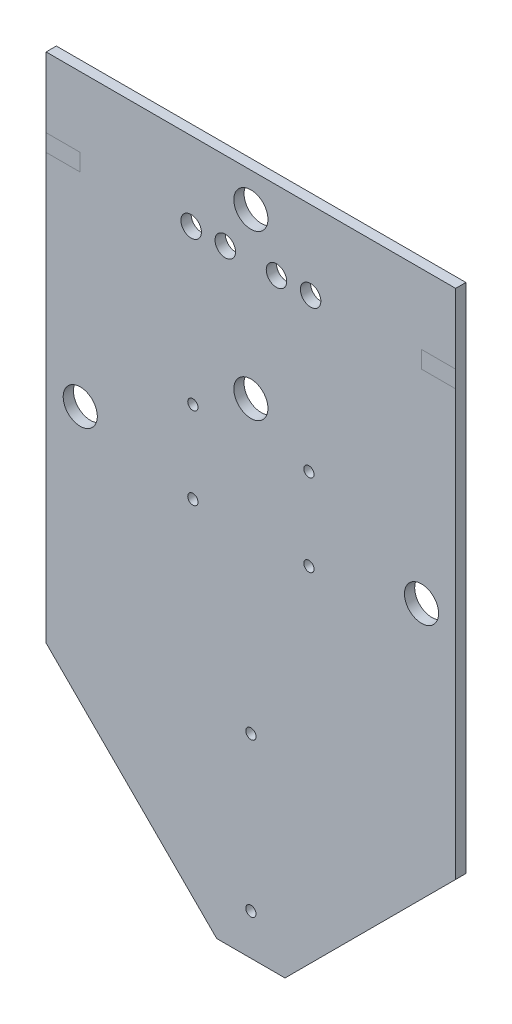
ISO-10303-21;
HEADER;
FILE_DESCRIPTION(('STEP AP214'),'2;1');
FILE_NAME('part.step','',(''),(''),'','','');
FILE_SCHEMA(('AUTOMOTIVE_DESIGN { 1 0 10303 214 1 1 1 1 }'));
ENDSEC;
DATA;
#1=APPLICATION_CONTEXT('core data for automotive mechanical design processes');
#2=APPLICATION_PROTOCOL_DEFINITION('international standard','automotive_design',2000,#1);
#3=PRODUCT_CONTEXT('',#1,'mechanical');
#4=PRODUCT('Part','Part','',(#3));
#5=PRODUCT_RELATED_PRODUCT_CATEGORY('part','',(#4));
#6=PRODUCT_DEFINITION_FORMATION('','',#4);
#7=PRODUCT_DEFINITION_CONTEXT('part definition',#1,'design');
#8=PRODUCT_DEFINITION('design','',#6,#7);
#9=PRODUCT_DEFINITION_SHAPE('','',#8);
#10=(LENGTH_UNIT() NAMED_UNIT(*) SI_UNIT(.MILLI.,.METRE.));
#11=(NAMED_UNIT(*) PLANE_ANGLE_UNIT() SI_UNIT($,.RADIAN.));
#12=(NAMED_UNIT(*) SI_UNIT($,.STERADIAN.) SOLID_ANGLE_UNIT());
#13=UNCERTAINTY_MEASURE_WITH_UNIT(LENGTH_MEASURE(1.E-05),#10,'distance_accuracy_value','');
#14=(GEOMETRIC_REPRESENTATION_CONTEXT(3) GLOBAL_UNCERTAINTY_ASSIGNED_CONTEXT((#13)) GLOBAL_UNIT_ASSIGNED_CONTEXT((#10,
#11,#12)) REPRESENTATION_CONTEXT('',''));
#15=CARTESIAN_POINT('',(0.,0.,0.));
#16=DIRECTION('',(0.,0.,1.));
#17=DIRECTION('',(1.,0.,0.));
#18=AXIS2_PLACEMENT_3D('',#15,#16,#17);
#19=CARTESIAN_POINT('',(0.,-200.,0.));
#20=DIRECTION('',(0.,0.,-1.));
#21=DIRECTION('',(-1.,0.,0.));
#22=AXIS2_PLACEMENT_3D('',#19,#20,#21);
#23=PLANE('',#22);
#24=CARTESIAN_POINT('',(-60.,-58.,0.));
#25=DIRECTION('',(0.,0.,-1.));
#26=DIRECTION('',(-1.,0.,0.));
#27=AXIS2_PLACEMENT_3D('',#24,#25,#26);
#28=CIRCLE('',#27,4.99999999999999);
#29=CARTESIAN_POINT('',(-65.,-58.,0.));
#30=VERTEX_POINT('',#29);
#31=EDGE_CURVE('E376',#30,#30,#28,.T.);
#32=ORIENTED_EDGE('',*,*,#31,.F.);
#33=EDGE_LOOP('',(#32));
#34=FACE_BOUND('',#33,.T.);
#35=CARTESIAN_POINT('',(-43.,-92.,0.));
#36=DIRECTION('',(0.,0.,1.));
#37=DIRECTION('',(1.,0.,0.));
#38=AXIS2_PLACEMENT_3D('',#35,#36,#37);
#39=CIRCLE('',#38,1.5);
#40=CARTESIAN_POINT('',(-41.5,-92.,0.));
#41=VERTEX_POINT('',#40);
#42=EDGE_CURVE('E363',#41,#41,#39,.T.);
#43=ORIENTED_EDGE('',*,*,#42,.T.);
#44=EDGE_LOOP('',(#43));
#45=FACE_BOUND('',#44,.T.);
#46=CARTESIAN_POINT('',(-77.,-68.,0.));
#47=DIRECTION('',(0.,0.,1.));
#48=DIRECTION('',(1.,0.,0.));
#49=AXIS2_PLACEMENT_3D('',#46,#47,#48);
#50=CIRCLE('',#49,1.5);
#51=CARTESIAN_POINT('',(-75.5,-68.,0.));
#52=VERTEX_POINT('',#51);
#53=EDGE_CURVE('E356',#52,#52,#50,.T.);
#54=ORIENTED_EDGE('',*,*,#53,.T.);
#55=EDGE_LOOP('',(#54));
#56=FACE_BOUND('',#55,.T.);
#57=DIRECTION('',(0.,1.,0.));
#58=VECTOR('',#57,1.);
#59=CARTESIAN_POINT('',(0.,-150.,0.));
#60=LINE('',#59,#58);
#61=CARTESIAN_POINT('',(0.,-150.,0.));
#62=VERTEX_POINT('',#61);
#63=CARTESIAN_POINT('',(0.,0.,0.));
#64=VERTEX_POINT('',#63);
#65=EDGE_CURVE('E310',#62,#64,#60,.T.);
#66=ORIENTED_EDGE('',*,*,#65,.F.);
#67=DIRECTION('',(0.707106781186548,0.707106781186547,0.));
#68=VECTOR('',#67,1.);
#69=CARTESIAN_POINT('',(-50.0000000000002,-200.,0.));
#70=LINE('',#69,#68);
#71=CARTESIAN_POINT('',(-50.0000000000002,-200.,0.));
#72=VERTEX_POINT('',#71);
#73=EDGE_CURVE('E338',#72,#62,#70,.T.);
#74=ORIENTED_EDGE('',*,*,#73,.F.);
#75=DIRECTION('',(1.,0.,0.));
#76=VECTOR('',#75,1.);
#77=CARTESIAN_POINT('',(-70.0000000000002,-200.,0.));
#78=LINE('',#77,#76);
#79=CARTESIAN_POINT('',(-70.0000000000002,-200.,0.));
#80=VERTEX_POINT('',#79);
#81=EDGE_CURVE('E336',#80,#72,#78,.T.);
#82=ORIENTED_EDGE('',*,*,#81,.F.);
#83=DIRECTION('',(0.707106781186546,-0.707106781186549,0.));
#84=VECTOR('',#83,1.);
#85=CARTESIAN_POINT('',(-120.,-150.,0.));
#86=LINE('',#85,#84);
#87=CARTESIAN_POINT('',(-120.,-150.,0.));
#88=VERTEX_POINT('',#87);
#89=EDGE_CURVE('E334',#88,#80,#86,.T.);
#90=ORIENTED_EDGE('',*,*,#89,.F.);
#91=DIRECTION('',(0.,-1.,0.));
#92=VECTOR('',#91,1.);
#93=CARTESIAN_POINT('',(-120.,0.,0.));
#94=LINE('',#93,#92);
#95=CARTESIAN_POINT('',(-120.,0.,0.));
#96=VERTEX_POINT('',#95);
#97=EDGE_CURVE('E332',#96,#88,#94,.T.);
#98=ORIENTED_EDGE('',*,*,#97,.F.);
#99=DIRECTION('',(-1.,0.,0.));
#100=VECTOR('',#99,1.);
#101=CARTESIAN_POINT('',(0.,0.,0.));
#102=LINE('',#101,#100);
#103=EDGE_CURVE('E330',#64,#96,#102,.T.);
#104=ORIENTED_EDGE('',*,*,#103,.F.);
#105=EDGE_LOOP('',(#66,#74,#82,#90,#98,#104));
#106=FACE_BOUND('',#105,.T.);
#107=CARTESIAN_POINT('',(-60.,-10.,0.));
#108=DIRECTION('',(0.,0.,-1.));
#109=DIRECTION('',(-1.,0.,0.));
#110=AXIS2_PLACEMENT_3D('',#107,#108,#109);
#111=CIRCLE('',#110,5.);
#112=CARTESIAN_POINT('',(-65.,-10.,0.));
#113=VERTEX_POINT('',#112);
#114=EDGE_CURVE('E304',#113,#113,#111,.T.);
#115=ORIENTED_EDGE('',*,*,#114,.F.);
#116=EDGE_LOOP('',(#115));
#117=FACE_BOUND('',#116,.T.);
#118=CARTESIAN_POINT('',(-9.99999999999992,-85.,0.));
#119=DIRECTION('',(0.,0.,-1.));
#120=DIRECTION('',(-1.,0.,0.));
#121=AXIS2_PLACEMENT_3D('',#118,#119,#120);
#122=CIRCLE('',#121,5.);
#123=CARTESIAN_POINT('',(-14.9999999999999,-85.,0.));
#124=VERTEX_POINT('',#123);
#125=EDGE_CURVE('E298',#124,#124,#122,.T.);
#126=ORIENTED_EDGE('',*,*,#125,.F.);
#127=EDGE_LOOP('',(#126));
#128=FACE_BOUND('',#127,.T.);
#129=CARTESIAN_POINT('',(-110.,-84.9999999999999,0.));
#130=DIRECTION('',(0.,0.,-1.));
#131=DIRECTION('',(-1.,0.,0.));
#132=AXIS2_PLACEMENT_3D('',#129,#130,#131);
#133=CIRCLE('',#132,5.00000000000002);
#134=CARTESIAN_POINT('',(-115.,-84.9999999999999,0.));
#135=VERTEX_POINT('',#134);
#136=EDGE_CURVE('E292',#135,#135,#133,.T.);
#137=ORIENTED_EDGE('',*,*,#136,.F.);
#138=EDGE_LOOP('',(#137));
#139=FACE_BOUND('',#138,.T.);
#140=CARTESIAN_POINT('',(-52.5,-23.,0.));
#141=DIRECTION('',(0.,0.,-1.));
#142=DIRECTION('',(-1.,0.,0.));
#143=AXIS2_PLACEMENT_3D('',#140,#141,#142);
#144=CIRCLE('',#143,3.);
#145=CARTESIAN_POINT('',(-55.5,-23.,0.));
#146=VERTEX_POINT('',#145);
#147=EDGE_CURVE('E286',#146,#146,#144,.T.);
#148=ORIENTED_EDGE('',*,*,#147,.F.);
#149=EDGE_LOOP('',(#148));
#150=FACE_BOUND('',#149,.T.);
#151=CARTESIAN_POINT('',(-42.5,-23.,0.));
#152=DIRECTION('',(0.,0.,-1.));
#153=DIRECTION('',(-1.,0.,0.));
#154=AXIS2_PLACEMENT_3D('',#151,#152,#153);
#155=CIRCLE('',#154,3.);
#156=CARTESIAN_POINT('',(-45.5,-23.,0.));
#157=VERTEX_POINT('',#156);
#158=EDGE_CURVE('E280',#157,#157,#155,.T.);
#159=ORIENTED_EDGE('',*,*,#158,.F.);
#160=EDGE_LOOP('',(#159));
#161=FACE_BOUND('',#160,.T.);
#162=CARTESIAN_POINT('',(-67.5,-23.,0.));
#163=DIRECTION('',(0.,0.,-1.));
#164=DIRECTION('',(1.,0.,0.));
#165=AXIS2_PLACEMENT_3D('',#162,#163,#164);
#166=CIRCLE('',#165,3.00000000000001);
#167=CARTESIAN_POINT('',(-64.5,-23.,0.));
#168=VERTEX_POINT('',#167);
#169=EDGE_CURVE('E274',#168,#168,#166,.T.);
#170=ORIENTED_EDGE('',*,*,#169,.F.);
#171=EDGE_LOOP('',(#170));
#172=FACE_BOUND('',#171,.T.);
#173=CARTESIAN_POINT('',(-77.5,-23.,0.));
#174=DIRECTION('',(0.,0.,-1.));
#175=DIRECTION('',(1.,0.,0.));
#176=AXIS2_PLACEMENT_3D('',#173,#174,#175);
#177=CIRCLE('',#176,3.00000000000001);
#178=CARTESIAN_POINT('',(-74.5,-23.,0.));
#179=VERTEX_POINT('',#178);
#180=EDGE_CURVE('E268',#179,#179,#177,.T.);
#181=ORIENTED_EDGE('',*,*,#180,.F.);
#182=EDGE_LOOP('',(#181));
#183=FACE_BOUND('',#182,.T.);
#184=CARTESIAN_POINT('',(-60.0000000000002,-143.,0.));
#185=DIRECTION('',(0.,0.,-1.));
#186=DIRECTION('',(-1.,0.,0.));
#187=AXIS2_PLACEMENT_3D('',#184,#185,#186);
#188=CIRCLE('',#187,1.5);
#189=CARTESIAN_POINT('',(-61.5000000000002,-143.,0.));
#190=VERTEX_POINT('',#189);
#191=EDGE_CURVE('E262',#190,#190,#188,.T.);
#192=ORIENTED_EDGE('',*,*,#191,.F.);
#193=EDGE_LOOP('',(#192));
#194=FACE_BOUND('',#193,.T.);
#195=CARTESIAN_POINT('',(-60.0000000000002,-188.,0.));
#196=DIRECTION('',(0.,0.,-1.));
#197=DIRECTION('',(-1.,0.,0.));
#198=AXIS2_PLACEMENT_3D('',#195,#196,#197);
#199=CIRCLE('',#198,1.5);
#200=CARTESIAN_POINT('',(-61.5000000000002,-188.,0.));
#201=VERTEX_POINT('',#200);
#202=EDGE_CURVE('E251',#201,#201,#199,.T.);
#203=ORIENTED_EDGE('',*,*,#202,.F.);
#204=EDGE_LOOP('',(#203));
#205=FACE_BOUND('',#204,.T.);
#206=DIRECTION('',(0.,-1.,0.));
#207=VECTOR('',#206,1.);
#208=CARTESIAN_POINT('',(-28.,-139.,0.));
#209=LINE('',#208,#207);
#210=CARTESIAN_POINT('',(-28.,-133.994670830339,0.));
#211=VERTEX_POINT('',#210);
#212=CARTESIAN_POINT('',(-28.,-139.,0.));
#213=VERTEX_POINT('',#212);
#214=EDGE_CURVE('E391',#211,#213,#209,.T.);
#215=ORIENTED_EDGE('',*,*,#214,.F.);
#216=DIRECTION('',(1.,0.,0.));
#217=VECTOR('',#216,1.);
#218=CARTESIAN_POINT('',(-28.,-133.994670830339,0.));
#219=LINE('',#218,#217);
#220=CARTESIAN_POINT('',(-30.,-133.994670830339,0.));
#221=VERTEX_POINT('',#220);
#222=EDGE_CURVE('E193',#221,#211,#219,.T.);
#223=ORIENTED_EDGE('',*,*,#222,.F.);
#224=DIRECTION('',(0.,1.,0.));
#225=VECTOR('',#224,1.);
#226=CARTESIAN_POINT('',(-30.,-133.994670830339,0.));
#227=LINE('',#226,#225);
#228=CARTESIAN_POINT('',(-30.,-137.,0.));
#229=VERTEX_POINT('',#228);
#230=EDGE_CURVE('E189',#229,#221,#227,.T.);
#231=ORIENTED_EDGE('',*,*,#230,.F.);
#232=DIRECTION('',(1.,0.,0.));
#233=VECTOR('',#232,1.);
#234=CARTESIAN_POINT('',(-30.,-137.,0.));
#235=LINE('',#234,#233);
#236=CARTESIAN_POINT('',(-31.859648796441,-137.,0.));
#237=VERTEX_POINT('',#236);
#238=EDGE_CURVE('E397',#237,#229,#235,.T.);
#239=ORIENTED_EDGE('',*,*,#238,.F.);
#240=DIRECTION('',(0.,1.,0.));
#241=VECTOR('',#240,1.);
#242=CARTESIAN_POINT('',(-31.859648796441,-137.,0.));
#243=LINE('',#242,#241);
#244=CARTESIAN_POINT('',(-31.859648796441,-139.,0.));
#245=VERTEX_POINT('',#244);
#246=EDGE_CURVE('E395',#245,#237,#243,.T.);
#247=ORIENTED_EDGE('',*,*,#246,.F.);
#248=DIRECTION('',(-1.,0.,0.));
#249=VECTOR('',#248,1.);
#250=CARTESIAN_POINT('',(-31.859648796441,-139.,0.));
#251=LINE('',#250,#249);
#252=EDGE_CURVE('E393',#213,#245,#251,.T.);
#253=ORIENTED_EDGE('',*,*,#252,.F.);
#254=EDGE_LOOP('',(#215,#223,#231,#239,#247,#253));
#255=FACE_BOUND('',#254,.T.);
#256=CARTESIAN_POINT('',(-43.,-68.,0.));
#257=DIRECTION('',(0.,0.,1.));
#258=DIRECTION('',(1.,0.,0.));
#259=AXIS2_PLACEMENT_3D('',#256,#257,#258);
#260=CIRCLE('',#259,1.5);
#261=CARTESIAN_POINT('',(-41.5,-68.,0.));
#262=VERTEX_POINT('',#261);
#263=EDGE_CURVE('E360',#262,#262,#260,.T.);
#264=ORIENTED_EDGE('',*,*,#263,.T.);
#265=EDGE_LOOP('',(#264));
#266=FACE_BOUND('',#265,.T.);
#267=CARTESIAN_POINT('',(-77.,-92.,0.));
#268=DIRECTION('',(0.,0.,1.));
#269=DIRECTION('',(1.,0.,0.));
#270=AXIS2_PLACEMENT_3D('',#267,#268,#269);
#271=CIRCLE('',#270,1.5);
#272=CARTESIAN_POINT('',(-75.5,-92.,0.));
#273=VERTEX_POINT('',#272);
#274=EDGE_CURVE('E366',#273,#273,#271,.T.);
#275=ORIENTED_EDGE('',*,*,#274,.T.);
#276=EDGE_LOOP('',(#275));
#277=FACE_BOUND('',#276,.T.);
#278=ADVANCED_FACE('F31',(#34,#45,#56,#106,#117,#128,#139,#150,#161,#172,#183,#194,#205,#255,
#266,#277),#23,.T.);
#279=CARTESIAN_POINT('',(0.,-200.,3.));
#280=DIRECTION('',(0.,0.,-1.));
#281=DIRECTION('',(-1.,0.,0.));
#282=AXIS2_PLACEMENT_3D('',#279,#280,#281);
#283=PLANE('',#282);
#284=CARTESIAN_POINT('',(-60.,-58.,3.));
#285=DIRECTION('',(0.,0.,-1.));
#286=DIRECTION('',(-1.,0.,0.));
#287=AXIS2_PLACEMENT_3D('',#284,#285,#286);
#288=CIRCLE('',#287,4.99999999999999);
#289=CARTESIAN_POINT('',(-65.,-58.,3.));
#290=VERTEX_POINT('',#289);
#291=EDGE_CURVE('E35',#290,#290,#288,.T.);
#292=ORIENTED_EDGE('',*,*,#291,.T.);
#293=EDGE_LOOP('',(#292));
#294=FACE_BOUND('',#293,.T.);
#295=CARTESIAN_POINT('',(-43.,-92.,3.));
#296=DIRECTION('',(0.,0.,-1.));
#297=DIRECTION('',(-1.,0.,0.));
#298=AXIS2_PLACEMENT_3D('',#295,#296,#297);
#299=CIRCLE('',#298,1.5);
#300=CARTESIAN_POINT('',(-44.5,-92.,3.));
#301=VERTEX_POINT('',#300);
#302=EDGE_CURVE('E361',#301,#301,#299,.F.);
#303=ORIENTED_EDGE('',*,*,#302,.F.);
#304=EDGE_LOOP('',(#303));
#305=FACE_BOUND('',#304,.T.);
#306=CARTESIAN_POINT('',(-77.,-68.,3.));
#307=DIRECTION('',(0.,0.,-1.));
#308=DIRECTION('',(-1.,0.,0.));
#309=AXIS2_PLACEMENT_3D('',#306,#307,#308);
#310=CIRCLE('',#309,1.5);
#311=CARTESIAN_POINT('',(-78.5,-68.,3.));
#312=VERTEX_POINT('',#311);
#313=EDGE_CURVE('E353',#312,#312,#310,.F.);
#314=ORIENTED_EDGE('',*,*,#313,.F.);
#315=EDGE_LOOP('',(#314));
#316=FACE_BOUND('',#315,.T.);
#317=CARTESIAN_POINT('',(-60.0000000000002,-188.,3.));
#318=DIRECTION('',(0.,0.,-1.));
#319=DIRECTION('',(-1.,0.,0.));
#320=AXIS2_PLACEMENT_3D('',#317,#318,#319);
#321=CIRCLE('',#320,1.5);
#322=CARTESIAN_POINT('',(-61.5000000000002,-188.,3.));
#323=VERTEX_POINT('',#322);
#324=EDGE_CURVE('E259',#323,#323,#321,.T.);
#325=ORIENTED_EDGE('',*,*,#324,.T.);
#326=EDGE_LOOP('',(#325));
#327=FACE_BOUND('',#326,.T.);
#328=CARTESIAN_POINT('',(-60.0000000000002,-143.,3.));
#329=DIRECTION('',(0.,0.,-1.));
#330=DIRECTION('',(-1.,0.,0.));
#331=AXIS2_PLACEMENT_3D('',#328,#329,#330);
#332=CIRCLE('',#331,1.5);
#333=CARTESIAN_POINT('',(-61.5000000000002,-143.,3.));
#334=VERTEX_POINT('',#333);
#335=EDGE_CURVE('E265',#334,#334,#332,.T.);
#336=ORIENTED_EDGE('',*,*,#335,.T.);
#337=EDGE_LOOP('',(#336));
#338=FACE_BOUND('',#337,.T.);
#339=CARTESIAN_POINT('',(-77.5,-23.,3.));
#340=DIRECTION('',(0.,0.,-1.));
#341=DIRECTION('',(-1.,0.,0.));
#342=AXIS2_PLACEMENT_3D('',#339,#340,#341);
#343=CIRCLE('',#342,3.00000000000001);
#344=CARTESIAN_POINT('',(-80.5,-23.,3.));
#345=VERTEX_POINT('',#344);
#346=EDGE_CURVE('E271',#345,#345,#343,.T.);
#347=ORIENTED_EDGE('',*,*,#346,.T.);
#348=EDGE_LOOP('',(#347));
#349=FACE_BOUND('',#348,.T.);
#350=CARTESIAN_POINT('',(-67.5,-23.,3.));
#351=DIRECTION('',(0.,0.,-1.));
#352=DIRECTION('',(-1.,0.,0.));
#353=AXIS2_PLACEMENT_3D('',#350,#351,#352);
#354=CIRCLE('',#353,3.00000000000001);
#355=CARTESIAN_POINT('',(-70.5,-23.,3.));
#356=VERTEX_POINT('',#355);
#357=EDGE_CURVE('E277',#356,#356,#354,.T.);
#358=ORIENTED_EDGE('',*,*,#357,.T.);
#359=EDGE_LOOP('',(#358));
#360=FACE_BOUND('',#359,.T.);
#361=CARTESIAN_POINT('',(-42.5,-23.,3.));
#362=DIRECTION('',(0.,0.,-1.));
#363=DIRECTION('',(-1.,0.,0.));
#364=AXIS2_PLACEMENT_3D('',#361,#362,#363);
#365=CIRCLE('',#364,3.);
#366=CARTESIAN_POINT('',(-45.5,-23.,3.));
#367=VERTEX_POINT('',#366);
#368=EDGE_CURVE('E283',#367,#367,#365,.T.);
#369=ORIENTED_EDGE('',*,*,#368,.T.);
#370=EDGE_LOOP('',(#369));
#371=FACE_BOUND('',#370,.T.);
#372=CARTESIAN_POINT('',(-52.5,-23.,3.));
#373=DIRECTION('',(0.,0.,-1.));
#374=DIRECTION('',(-1.,0.,0.));
#375=AXIS2_PLACEMENT_3D('',#372,#373,#374);
#376=CIRCLE('',#375,3.);
#377=CARTESIAN_POINT('',(-55.5,-23.,3.));
#378=VERTEX_POINT('',#377);
#379=EDGE_CURVE('E289',#378,#378,#376,.T.);
#380=ORIENTED_EDGE('',*,*,#379,.T.);
#381=EDGE_LOOP('',(#380));
#382=FACE_BOUND('',#381,.T.);
#383=CARTESIAN_POINT('',(-110.,-84.9999999999999,3.));
#384=DIRECTION('',(0.,0.,-1.));
#385=DIRECTION('',(-1.,0.,0.));
#386=AXIS2_PLACEMENT_3D('',#383,#384,#385);
#387=CIRCLE('',#386,5.00000000000002);
#388=CARTESIAN_POINT('',(-115.,-84.9999999999999,3.));
#389=VERTEX_POINT('',#388);
#390=EDGE_CURVE('E295',#389,#389,#387,.T.);
#391=ORIENTED_EDGE('',*,*,#390,.T.);
#392=EDGE_LOOP('',(#391));
#393=FACE_BOUND('',#392,.T.);
#394=CARTESIAN_POINT('',(-9.99999999999992,-85.,3.));
#395=DIRECTION('',(0.,0.,-1.));
#396=DIRECTION('',(-1.,0.,0.));
#397=AXIS2_PLACEMENT_3D('',#394,#395,#396);
#398=CIRCLE('',#397,5.);
#399=CARTESIAN_POINT('',(-14.9999999999999,-85.,3.));
#400=VERTEX_POINT('',#399);
#401=EDGE_CURVE('E301',#400,#400,#398,.T.);
#402=ORIENTED_EDGE('',*,*,#401,.T.);
#403=EDGE_LOOP('',(#402));
#404=FACE_BOUND('',#403,.T.);
#405=CARTESIAN_POINT('',(-60.,-10.,3.));
#406=DIRECTION('',(0.,0.,-1.));
#407=DIRECTION('',(-1.,0.,0.));
#408=AXIS2_PLACEMENT_3D('',#405,#406,#407);
#409=CIRCLE('',#408,5.);
#410=CARTESIAN_POINT('',(-65.,-10.,3.));
#411=VERTEX_POINT('',#410);
#412=EDGE_CURVE('E307',#411,#411,#409,.T.);
#413=ORIENTED_EDGE('',*,*,#412,.T.);
#414=EDGE_LOOP('',(#413));
#415=FACE_BOUND('',#414,.T.);
#416=DIRECTION('',(0.,-1.,0.));
#417=VECTOR('',#416,1.);
#418=CARTESIAN_POINT('',(-9.99999999999999,-20.5,3.));
#419=LINE('',#418,#417);
#420=CARTESIAN_POINT('',(-9.99999999999999,-20.5,3.));
#421=VERTEX_POINT('',#420);
#422=CARTESIAN_POINT('',(-9.99999999999999,-25.5,3.));
#423=VERTEX_POINT('',#422);
#424=EDGE_CURVE('E196',#421,#423,#419,.T.);
#425=ORIENTED_EDGE('',*,*,#424,.F.);
#426=DIRECTION('',(-1.,0.,0.));
#427=VECTOR('',#426,1.);
#428=CARTESIAN_POINT('',(0.,-20.5,3.));
#429=LINE('',#428,#427);
#430=CARTESIAN_POINT('',(0.,-20.5,3.));
#431=VERTEX_POINT('',#430);
#432=EDGE_CURVE('E56',#431,#421,#429,.T.);
#433=ORIENTED_EDGE('',*,*,#432,.F.);
#434=DIRECTION('',(0.,1.,0.));
#435=VECTOR('',#434,1.);
#436=CARTESIAN_POINT('',(0.,-150.,3.));
#437=LINE('',#436,#435);
#438=CARTESIAN_POINT('',(0.,0.,3.));
#439=VERTEX_POINT('',#438);
#440=EDGE_CURVE('E315',#431,#439,#437,.T.);
#441=ORIENTED_EDGE('',*,*,#440,.T.);
#442=DIRECTION('',(-1.,0.,0.));
#443=VECTOR('',#442,1.);
#444=CARTESIAN_POINT('',(0.,0.,3.));
#445=LINE('',#444,#443);
#446=CARTESIAN_POINT('',(-120.,0.,3.));
#447=VERTEX_POINT('',#446);
#448=EDGE_CURVE('E314',#439,#447,#445,.T.);
#449=ORIENTED_EDGE('',*,*,#448,.T.);
#450=DIRECTION('',(0.,-1.,0.));
#451=VECTOR('',#450,1.);
#452=CARTESIAN_POINT('',(-120.,0.,3.));
#453=LINE('',#452,#451);
#454=CARTESIAN_POINT('',(-120.,-20.5,3.));
#455=VERTEX_POINT('',#454);
#456=EDGE_CURVE('E318',#447,#455,#453,.T.);
#457=ORIENTED_EDGE('',*,*,#456,.T.);
#458=DIRECTION('',(-1.,0.,0.));
#459=VECTOR('',#458,1.);
#460=CARTESIAN_POINT('',(-120.,-20.5,3.));
#461=LINE('',#460,#459);
#462=CARTESIAN_POINT('',(-110.,-20.5,3.));
#463=VERTEX_POINT('',#462);
#464=EDGE_CURVE('E232',#463,#455,#461,.T.);
#465=ORIENTED_EDGE('',*,*,#464,.F.);
#466=DIRECTION('',(0.,1.,0.));
#467=VECTOR('',#466,1.);
#468=CARTESIAN_POINT('',(-110.,-20.5,3.));
#469=LINE('',#468,#467);
#470=CARTESIAN_POINT('',(-110.,-25.5,3.));
#471=VERTEX_POINT('',#470);
#472=EDGE_CURVE('E244',#471,#463,#469,.T.);
#473=ORIENTED_EDGE('',*,*,#472,.F.);
#474=DIRECTION('',(1.,0.,0.));
#475=VECTOR('',#474,1.);
#476=CARTESIAN_POINT('',(-120.,-25.5,3.));
#477=LINE('',#476,#475);
#478=CARTESIAN_POINT('',(-120.,-25.5,3.));
#479=VERTEX_POINT('',#478);
#480=EDGE_CURVE('E221',#479,#471,#477,.T.);
#481=ORIENTED_EDGE('',*,*,#480,.F.);
#482=CARTESIAN_POINT('',(-120.,-150.,3.));
#483=VERTEX_POINT('',#482);
#484=EDGE_CURVE('E317',#479,#483,#453,.T.);
#485=ORIENTED_EDGE('',*,*,#484,.T.);
#486=DIRECTION('',(0.707106781186546,-0.707106781186549,0.));
#487=VECTOR('',#486,1.);
#488=CARTESIAN_POINT('',(-120.,-150.,3.));
#489=LINE('',#488,#487);
#490=CARTESIAN_POINT('',(-70.0000000000002,-200.,3.));
#491=VERTEX_POINT('',#490);
#492=EDGE_CURVE('E321',#483,#491,#489,.T.);
#493=ORIENTED_EDGE('',*,*,#492,.T.);
#494=DIRECTION('',(1.,0.,0.));
#495=VECTOR('',#494,1.);
#496=CARTESIAN_POINT('',(-70.0000000000002,-200.,3.));
#497=LINE('',#496,#495);
#498=CARTESIAN_POINT('',(-50.0000000000002,-200.,3.));
#499=VERTEX_POINT('',#498);
#500=EDGE_CURVE('E323',#491,#499,#497,.T.);
#501=ORIENTED_EDGE('',*,*,#500,.T.);
#502=DIRECTION('',(0.707106781186548,0.707106781186547,0.));
#503=VECTOR('',#502,1.);
#504=CARTESIAN_POINT('',(-50.0000000000002,-200.,3.));
#505=LINE('',#504,#503);
#506=CARTESIAN_POINT('',(0.,-150.,3.));
#507=VERTEX_POINT('',#506);
#508=EDGE_CURVE('E325',#499,#507,#505,.T.);
#509=ORIENTED_EDGE('',*,*,#508,.T.);
#510=CARTESIAN_POINT('',(0.,-25.5,3.));
#511=VERTEX_POINT('',#510);
#512=EDGE_CURVE('E311',#507,#511,#437,.T.);
#513=ORIENTED_EDGE('',*,*,#512,.T.);
#514=DIRECTION('',(1.,0.,0.));
#515=VECTOR('',#514,1.);
#516=CARTESIAN_POINT('',(0.,-25.5,3.));
#517=LINE('',#516,#515);
#518=EDGE_CURVE('E206',#423,#511,#517,.T.);
#519=ORIENTED_EDGE('',*,*,#518,.F.);
#520=EDGE_LOOP('',(#425,#433,#441,#449,#457,#465,#473,#481,#485,#493,#501,#509,#513,#519));
#521=FACE_BOUND('',#520,.T.);
#522=CARTESIAN_POINT('',(-43.,-68.,3.));
#523=DIRECTION('',(0.,0.,-1.));
#524=DIRECTION('',(-1.,0.,0.));
#525=AXIS2_PLACEMENT_3D('',#522,#523,#524);
#526=CIRCLE('',#525,1.5);
#527=CARTESIAN_POINT('',(-44.5,-68.,3.));
#528=VERTEX_POINT('',#527);
#529=EDGE_CURVE('E357',#528,#528,#526,.F.);
#530=ORIENTED_EDGE('',*,*,#529,.F.);
#531=EDGE_LOOP('',(#530));
#532=FACE_BOUND('',#531,.T.);
#533=CARTESIAN_POINT('',(-77.,-92.,3.));
#534=DIRECTION('',(0.,0.,-1.));
#535=DIRECTION('',(-1.,0.,0.));
#536=AXIS2_PLACEMENT_3D('',#533,#534,#535);
#537=CIRCLE('',#536,1.5);
#538=CARTESIAN_POINT('',(-78.5,-92.,3.));
#539=VERTEX_POINT('',#538);
#540=EDGE_CURVE('E364',#539,#539,#537,.F.);
#541=ORIENTED_EDGE('',*,*,#540,.F.);
#542=EDGE_LOOP('',(#541));
#543=FACE_BOUND('',#542,.T.);
#544=ADVANCED_FACE('F430',(#294,#305,#316,#327,#338,#349,#360,#371,#382,#393,#404,#415,#521,
#532,#543),#283,.F.);
#545=CARTESIAN_POINT('',(0.,-150.,3.));
#546=DIRECTION('',(-1.,0.,0.));
#547=DIRECTION('',(0.,0.,1.));
#548=AXIS2_PLACEMENT_3D('',#545,#546,#547);
#549=PLANE('',#548);
#550=ORIENTED_EDGE('',*,*,#440,.F.);
#551=DIRECTION('',(0.,0.,1.));
#552=VECTOR('',#551,1.);
#553=CARTESIAN_POINT('',(0.,-20.5,2.9999));
#554=LINE('',#553,#552);
#555=CARTESIAN_POINT('',(0.,-20.5,2.9999));
#556=VERTEX_POINT('',#555);
#557=EDGE_CURVE('E219',#556,#431,#554,.T.);
#558=ORIENTED_EDGE('',*,*,#557,.F.);
#559=DIRECTION('',(0.,1.,0.));
#560=VECTOR('',#559,1.);
#561=CARTESIAN_POINT('',(0.,-20.5,2.9999));
#562=LINE('',#561,#560);
#563=CARTESIAN_POINT('',(0.,-25.5,2.9999));
#564=VERTEX_POINT('',#563);
#565=EDGE_CURVE('E212',#564,#556,#562,.T.);
#566=ORIENTED_EDGE('',*,*,#565,.F.);
#567=DIRECTION('',(0.,0.,1.));
#568=VECTOR('',#567,1.);
#569=CARTESIAN_POINT('',(0.,-25.5,2.9999));
#570=LINE('',#569,#568);
#571=EDGE_CURVE('E222',#564,#511,#570,.T.);
#572=ORIENTED_EDGE('',*,*,#571,.T.);
#573=ORIENTED_EDGE('',*,*,#512,.F.);
#574=DIRECTION('',(0.,0.,-1.));
#575=VECTOR('',#574,1.);
#576=CARTESIAN_POINT('',(0.,-150.,3.));
#577=LINE('',#576,#575);
#578=EDGE_CURVE('E327',#507,#62,#577,.T.);
#579=ORIENTED_EDGE('',*,*,#578,.T.);
#580=ORIENTED_EDGE('',*,*,#65,.T.);
#581=DIRECTION('',(0.,0.,-1.));
#582=VECTOR('',#581,1.);
#583=CARTESIAN_POINT('',(0.,0.,3.));
#584=LINE('',#583,#582);
#585=EDGE_CURVE('E11',#439,#64,#584,.T.);
#586=ORIENTED_EDGE('',*,*,#585,.F.);
#587=EDGE_LOOP('',(#550,#558,#566,#572,#573,#579,#580,#586));
#588=FACE_BOUND('',#587,.T.);
#589=ADVANCED_FACE('F33',(#588),#549,.F.);
#590=CARTESIAN_POINT('',(0.,0.,3.));
#591=DIRECTION('',(0.,-1.,0.));
#592=DIRECTION('',(1.,0.,0.));
#593=AXIS2_PLACEMENT_3D('',#590,#591,#592);
#594=PLANE('',#593);
#595=ORIENTED_EDGE('',*,*,#103,.T.);
#596=DIRECTION('',(0.,0.,-1.));
#597=VECTOR('',#596,1.);
#598=CARTESIAN_POINT('',(-120.,0.,3.));
#599=LINE('',#598,#597);
#600=EDGE_CURVE('E40',#447,#96,#599,.T.);
#601=ORIENTED_EDGE('',*,*,#600,.F.);
#602=ORIENTED_EDGE('',*,*,#448,.F.);
#603=ORIENTED_EDGE('',*,*,#585,.T.);
#604=EDGE_LOOP('',(#595,#601,#602,#603));
#605=FACE_BOUND('',#604,.T.);
#606=ADVANCED_FACE('F457',(#605),#594,.F.);
#607=CARTESIAN_POINT('',(-120.,0.,3.));
#608=DIRECTION('',(1.,0.,0.));
#609=DIRECTION('',(0.,1.,0.));
#610=AXIS2_PLACEMENT_3D('',#607,#608,#609);
#611=PLANE('',#610);
#612=DIRECTION('',(0.,-1.,0.));
#613=VECTOR('',#612,1.);
#614=CARTESIAN_POINT('',(-120.,-20.5,2.9999));
#615=LINE('',#614,#613);
#616=CARTESIAN_POINT('',(-120.,-20.5,2.9999));
#617=VERTEX_POINT('',#616);
#618=CARTESIAN_POINT('',(-120.,-25.5,2.9999));
#619=VERTEX_POINT('',#618);
#620=EDGE_CURVE('E228',#617,#619,#615,.T.);
#621=ORIENTED_EDGE('',*,*,#620,.F.);
#622=DIRECTION('',(0.,0.,1.));
#623=VECTOR('',#622,1.);
#624=CARTESIAN_POINT('',(-120.,-20.5,2.9999));
#625=LINE('',#624,#623);
#626=EDGE_CURVE('E248',#617,#455,#625,.T.);
#627=ORIENTED_EDGE('',*,*,#626,.T.);
#628=ORIENTED_EDGE('',*,*,#456,.F.);
#629=ORIENTED_EDGE('',*,*,#600,.T.);
#630=ORIENTED_EDGE('',*,*,#97,.T.);
#631=DIRECTION('',(0.,0.,-1.));
#632=VECTOR('',#631,1.);
#633=CARTESIAN_POINT('',(-120.,-150.,3.));
#634=LINE('',#633,#632);
#635=EDGE_CURVE('E348',#483,#88,#634,.T.);
#636=ORIENTED_EDGE('',*,*,#635,.F.);
#637=ORIENTED_EDGE('',*,*,#484,.F.);
#638=DIRECTION('',(0.,0.,1.));
#639=VECTOR('',#638,1.);
#640=CARTESIAN_POINT('',(-120.,-25.5,2.9999));
#641=LINE('',#640,#639);
#642=EDGE_CURVE('E241',#619,#479,#641,.T.);
#643=ORIENTED_EDGE('',*,*,#642,.F.);
#644=EDGE_LOOP('',(#621,#627,#628,#629,#630,#636,#637,#643));
#645=FACE_BOUND('',#644,.T.);
#646=ADVANCED_FACE('F454',(#645),#611,.F.);
#647=CARTESIAN_POINT('',(-120.,-150.,3.));
#648=DIRECTION('',(0.707106781186549,0.707106781186546,0.));
#649=DIRECTION('',(-0.707106781186546,0.707106781186549,0.));
#650=AXIS2_PLACEMENT_3D('',#647,#648,#649);
#651=PLANE('',#650);
#652=ORIENTED_EDGE('',*,*,#89,.T.);
#653=DIRECTION('',(0.,0.,-1.));
#654=VECTOR('',#653,1.);
#655=CARTESIAN_POINT('',(-70.0000000000002,-200.,3.));
#656=LINE('',#655,#654);
#657=EDGE_CURVE('E345',#491,#80,#656,.T.);
#658=ORIENTED_EDGE('',*,*,#657,.F.);
#659=ORIENTED_EDGE('',*,*,#492,.F.);
#660=ORIENTED_EDGE('',*,*,#635,.T.);
#661=EDGE_LOOP('',(#652,#658,#659,#660));
#662=FACE_BOUND('',#661,.T.);
#663=ADVANCED_FACE('F450',(#662),#651,.F.);
#664=CARTESIAN_POINT('',(-70.0000000000002,-200.,3.));
#665=DIRECTION('',(0.,1.,0.));
#666=DIRECTION('',(0.,0.,1.));
#667=AXIS2_PLACEMENT_3D('',#664,#665,#666);
#668=PLANE('',#667);
#669=ORIENTED_EDGE('',*,*,#81,.T.);
#670=DIRECTION('',(0.,0.,-1.));
#671=VECTOR('',#670,1.);
#672=CARTESIAN_POINT('',(-50.0000000000002,-200.,3.));
#673=LINE('',#672,#671);
#674=EDGE_CURVE('E342',#499,#72,#673,.T.);
#675=ORIENTED_EDGE('',*,*,#674,.F.);
#676=ORIENTED_EDGE('',*,*,#500,.F.);
#677=ORIENTED_EDGE('',*,*,#657,.T.);
#678=EDGE_LOOP('',(#669,#675,#676,#677));
#679=FACE_BOUND('',#678,.T.);
#680=ADVANCED_FACE('F446',(#679),#668,.F.);
#681=CARTESIAN_POINT('',(-50.0000000000002,-200.,3.));
#682=DIRECTION('',(-0.707106781186547,0.707106781186548,0.));
#683=DIRECTION('',(-0.707106781186548,-0.707106781186547,0.));
#684=AXIS2_PLACEMENT_3D('',#681,#682,#683);
#685=PLANE('',#684);
#686=ORIENTED_EDGE('',*,*,#73,.T.);
#687=ORIENTED_EDGE('',*,*,#578,.F.);
#688=ORIENTED_EDGE('',*,*,#508,.F.);
#689=ORIENTED_EDGE('',*,*,#674,.T.);
#690=EDGE_LOOP('',(#686,#687,#688,#689));
#691=FACE_BOUND('',#690,.T.);
#692=ADVANCED_FACE('F442',(#691),#685,.F.);
#693=CARTESIAN_POINT('',(-60.,-10.,16.));
#694=DIRECTION('',(0.,0.,-1.));
#695=DIRECTION('',(-1.,0.,0.));
#696=AXIS2_PLACEMENT_3D('',#693,#694,#695);
#697=CYLINDRICAL_SURFACE('',#696,5.);
#698=ORIENTED_EDGE('',*,*,#114,.T.);
#699=EDGE_LOOP('',(#698));
#700=FACE_BOUND('',#699,.T.);
#701=ORIENTED_EDGE('',*,*,#412,.F.);
#702=EDGE_LOOP('',(#701));
#703=FACE_BOUND('',#702,.T.);
#704=ADVANCED_FACE('F445',(#700,#703),#697,.F.);
#705=CARTESIAN_POINT('',(-9.99999999999992,-85.,16.));
#706=DIRECTION('',(0.,0.,-1.));
#707=DIRECTION('',(-1.,0.,0.));
#708=AXIS2_PLACEMENT_3D('',#705,#706,#707);
#709=CYLINDRICAL_SURFACE('',#708,5.);
#710=ORIENTED_EDGE('',*,*,#125,.T.);
#711=EDGE_LOOP('',(#710));
#712=FACE_BOUND('',#711,.T.);
#713=ORIENTED_EDGE('',*,*,#401,.F.);
#714=EDGE_LOOP('',(#713));
#715=FACE_BOUND('',#714,.T.);
#716=ADVANCED_FACE('F564',(#712,#715),#709,.F.);
#717=CARTESIAN_POINT('',(-110.,-84.9999999999999,16.));
#718=DIRECTION('',(0.,0.,-1.));
#719=DIRECTION('',(-1.,0.,0.));
#720=AXIS2_PLACEMENT_3D('',#717,#718,#719);
#721=CYLINDRICAL_SURFACE('',#720,5.00000000000002);
#722=ORIENTED_EDGE('',*,*,#136,.T.);
#723=EDGE_LOOP('',(#722));
#724=FACE_BOUND('',#723,.T.);
#725=ORIENTED_EDGE('',*,*,#390,.F.);
#726=EDGE_LOOP('',(#725));
#727=FACE_BOUND('',#726,.T.);
#728=ADVANCED_FACE('F560',(#724,#727),#721,.F.);
#729=CARTESIAN_POINT('',(-52.5,-23.,8.));
#730=DIRECTION('',(0.,0.,-1.));
#731=DIRECTION('',(-1.,0.,0.));
#732=AXIS2_PLACEMENT_3D('',#729,#730,#731);
#733=CYLINDRICAL_SURFACE('',#732,3.);
#734=ORIENTED_EDGE('',*,*,#147,.T.);
#735=EDGE_LOOP('',(#734));
#736=FACE_BOUND('',#735,.T.);
#737=ORIENTED_EDGE('',*,*,#379,.F.);
#738=EDGE_LOOP('',(#737));
#739=FACE_BOUND('',#738,.T.);
#740=ADVANCED_FACE('F556',(#736,#739),#733,.F.);
#741=CARTESIAN_POINT('',(-42.5,-23.,8.));
#742=DIRECTION('',(0.,0.,-1.));
#743=DIRECTION('',(-1.,0.,0.));
#744=AXIS2_PLACEMENT_3D('',#741,#742,#743);
#745=CYLINDRICAL_SURFACE('',#744,3.);
#746=ORIENTED_EDGE('',*,*,#158,.T.);
#747=EDGE_LOOP('',(#746));
#748=FACE_BOUND('',#747,.T.);
#749=ORIENTED_EDGE('',*,*,#368,.F.);
#750=EDGE_LOOP('',(#749));
#751=FACE_BOUND('',#750,.T.);
#752=ADVANCED_FACE('F552',(#748,#751),#745,.F.);
#753=CARTESIAN_POINT('',(-67.5,-23.,8.));
#754=DIRECTION('',(0.,0.,-1.));
#755=DIRECTION('',(-1.,0.,0.));
#756=AXIS2_PLACEMENT_3D('',#753,#754,#755);
#757=CYLINDRICAL_SURFACE('',#756,3.00000000000001);
#758=ORIENTED_EDGE('',*,*,#169,.T.);
#759=EDGE_LOOP('',(#758));
#760=FACE_BOUND('',#759,.T.);
#761=ORIENTED_EDGE('',*,*,#357,.F.);
#762=EDGE_LOOP('',(#761));
#763=FACE_BOUND('',#762,.T.);
#764=ADVANCED_FACE('F548',(#760,#763),#757,.F.);
#765=CARTESIAN_POINT('',(-77.5,-23.,8.));
#766=DIRECTION('',(0.,0.,-1.));
#767=DIRECTION('',(-1.,0.,0.));
#768=AXIS2_PLACEMENT_3D('',#765,#766,#767);
#769=CYLINDRICAL_SURFACE('',#768,3.00000000000001);
#770=ORIENTED_EDGE('',*,*,#180,.T.);
#771=EDGE_LOOP('',(#770));
#772=FACE_BOUND('',#771,.T.);
#773=ORIENTED_EDGE('',*,*,#346,.F.);
#774=EDGE_LOOP('',(#773));
#775=FACE_BOUND('',#774,.T.);
#776=ADVANCED_FACE('F544',(#772,#775),#769,.F.);
#777=CARTESIAN_POINT('',(-60.0000000000002,-143.,10.));
#778=DIRECTION('',(0.,0.,-1.));
#779=DIRECTION('',(-1.,0.,0.));
#780=AXIS2_PLACEMENT_3D('',#777,#778,#779);
#781=CYLINDRICAL_SURFACE('',#780,1.5);
#782=ORIENTED_EDGE('',*,*,#191,.T.);
#783=EDGE_LOOP('',(#782));
#784=FACE_BOUND('',#783,.T.);
#785=ORIENTED_EDGE('',*,*,#335,.F.);
#786=EDGE_LOOP('',(#785));
#787=FACE_BOUND('',#786,.T.);
#788=ADVANCED_FACE('F540',(#784,#787),#781,.F.);
#789=CARTESIAN_POINT('',(-60.0000000000002,-188.,10.));
#790=DIRECTION('',(0.,0.,-1.));
#791=DIRECTION('',(-1.,0.,0.));
#792=AXIS2_PLACEMENT_3D('',#789,#790,#791);
#793=CYLINDRICAL_SURFACE('',#792,1.5);
#794=ORIENTED_EDGE('',*,*,#202,.T.);
#795=EDGE_LOOP('',(#794));
#796=FACE_BOUND('',#795,.T.);
#797=ORIENTED_EDGE('',*,*,#324,.F.);
#798=EDGE_LOOP('',(#797));
#799=FACE_BOUND('',#798,.T.);
#800=ADVANCED_FACE('F532',(#796,#799),#793,.F.);
#801=CARTESIAN_POINT('',(-120.,-20.5,2.9999));
#802=DIRECTION('',(0.,1.,0.));
#803=DIRECTION('',(0.,0.,1.));
#804=AXIS2_PLACEMENT_3D('',#801,#802,#803);
#805=PLANE('',#804);
#806=ORIENTED_EDGE('',*,*,#464,.T.);
#807=ORIENTED_EDGE('',*,*,#626,.F.);
#808=DIRECTION('',(-1.,0.,0.));
#809=VECTOR('',#808,1.);
#810=CARTESIAN_POINT('',(-120.,-20.5,2.9999));
#811=LINE('',#810,#809);
#812=CARTESIAN_POINT('',(-110.,-20.5,2.9999));
#813=VERTEX_POINT('',#812);
#814=EDGE_CURVE('E238',#813,#617,#811,.T.);
#815=ORIENTED_EDGE('',*,*,#814,.F.);
#816=DIRECTION('',(0.,0.,1.));
#817=VECTOR('',#816,1.);
#818=CARTESIAN_POINT('',(-110.,-20.5,2.9999));
#819=LINE('',#818,#817);
#820=EDGE_CURVE('E252',#813,#463,#819,.T.);
#821=ORIENTED_EDGE('',*,*,#820,.T.);
#822=EDGE_LOOP('',(#806,#807,#815,#821));
#823=FACE_BOUND('',#822,.T.);
#824=ADVANCED_FACE('F498',(#823),#805,.F.);
#825=CARTESIAN_POINT('',(-110.,-20.5,2.9999));
#826=DIRECTION('',(1.,0.,0.));
#827=DIRECTION('',(0.,0.,-1.));
#828=AXIS2_PLACEMENT_3D('',#825,#826,#827);
#829=PLANE('',#828);
#830=ORIENTED_EDGE('',*,*,#472,.T.);
#831=ORIENTED_EDGE('',*,*,#820,.F.);
#832=DIRECTION('',(0.,1.,0.));
#833=VECTOR('',#832,1.);
#834=CARTESIAN_POINT('',(-110.,-20.5,2.9999));
#835=LINE('',#834,#833);
#836=CARTESIAN_POINT('',(-110.,-25.5,2.9999));
#837=VERTEX_POINT('',#836);
#838=EDGE_CURVE('E235',#837,#813,#835,.T.);
#839=ORIENTED_EDGE('',*,*,#838,.F.);
#840=DIRECTION('',(0.,0.,1.));
#841=VECTOR('',#840,1.);
#842=CARTESIAN_POINT('',(-110.,-25.5,2.9999));
#843=LINE('',#842,#841);
#844=EDGE_CURVE('E254',#837,#471,#843,.T.);
#845=ORIENTED_EDGE('',*,*,#844,.T.);
#846=EDGE_LOOP('',(#830,#831,#839,#845));
#847=FACE_BOUND('',#846,.T.);
#848=ADVANCED_FACE('F531',(#847),#829,.F.);
#849=CARTESIAN_POINT('',(-120.,-25.5,2.9999));
#850=DIRECTION('',(0.,-1.,0.));
#851=DIRECTION('',(1.,0.,0.));
#852=AXIS2_PLACEMENT_3D('',#849,#850,#851);
#853=PLANE('',#852);
#854=ORIENTED_EDGE('',*,*,#480,.T.);
#855=ORIENTED_EDGE('',*,*,#844,.F.);
#856=DIRECTION('',(1.,0.,0.));
#857=VECTOR('',#856,1.);
#858=CARTESIAN_POINT('',(-120.,-25.5,2.9999));
#859=LINE('',#858,#857);
#860=EDGE_CURVE('E231',#619,#837,#859,.T.);
#861=ORIENTED_EDGE('',*,*,#860,.F.);
#862=ORIENTED_EDGE('',*,*,#642,.T.);
#863=EDGE_LOOP('',(#854,#855,#861,#862));
#864=FACE_BOUND('',#863,.T.);
#865=ADVANCED_FACE('F492',(#864),#853,.F.);
#866=CARTESIAN_POINT('',(-120.,-20.5,2.9999));
#867=DIRECTION('',(0.,0.,1.));
#868=DIRECTION('',(1.,0.,0.));
#869=AXIS2_PLACEMENT_3D('',#866,#867,#868);
#870=PLANE('',#869);
#871=ORIENTED_EDGE('',*,*,#620,.T.);
#872=ORIENTED_EDGE('',*,*,#860,.T.);
#873=ORIENTED_EDGE('',*,*,#838,.T.);
#874=ORIENTED_EDGE('',*,*,#814,.T.);
#875=EDGE_LOOP('',(#871,#872,#873,#874));
#876=FACE_BOUND('',#875,.T.);
#877=ADVANCED_FACE('F495',(#876),#870,.T.);
#878=CARTESIAN_POINT('',(0.,-20.5,2.9999));
#879=DIRECTION('',(0.,1.,0.));
#880=DIRECTION('',(-1.,0.,0.));
#881=AXIS2_PLACEMENT_3D('',#878,#879,#880);
#882=PLANE('',#881);
#883=ORIENTED_EDGE('',*,*,#432,.T.);
#884=DIRECTION('',(0.,0.,1.));
#885=VECTOR('',#884,1.);
#886=CARTESIAN_POINT('',(-9.99999999999999,-20.5,2.9999));
#887=LINE('',#886,#885);
#888=CARTESIAN_POINT('',(-9.99999999999999,-20.5,2.9999));
#889=VERTEX_POINT('',#888);
#890=EDGE_CURVE('E214',#889,#421,#887,.T.);
#891=ORIENTED_EDGE('',*,*,#890,.F.);
#892=DIRECTION('',(-1.,0.,0.));
#893=VECTOR('',#892,1.);
#894=CARTESIAN_POINT('',(0.,-20.5,2.9999));
#895=LINE('',#894,#893);
#896=EDGE_CURVE('E202',#556,#889,#895,.T.);
#897=ORIENTED_EDGE('',*,*,#896,.F.);
#898=ORIENTED_EDGE('',*,*,#557,.T.);
#899=EDGE_LOOP('',(#883,#891,#897,#898));
#900=FACE_BOUND('',#899,.T.);
#901=ADVANCED_FACE('F511',(#900),#882,.F.);
#902=CARTESIAN_POINT('',(0.,-25.5,2.9999));
#903=DIRECTION('',(0.,-1.,0.));
#904=DIRECTION('',(1.,0.,0.));
#905=AXIS2_PLACEMENT_3D('',#902,#903,#904);
#906=PLANE('',#905);
#907=ORIENTED_EDGE('',*,*,#518,.T.);
#908=ORIENTED_EDGE('',*,*,#571,.F.);
#909=DIRECTION('',(1.,0.,0.));
#910=VECTOR('',#909,1.);
#911=CARTESIAN_POINT('',(0.,-25.5,2.9999));
#912=LINE('',#911,#910);
#913=CARTESIAN_POINT('',(-9.99999999999999,-25.5,2.9999));
#914=VERTEX_POINT('',#913);
#915=EDGE_CURVE('E209',#914,#564,#912,.T.);
#916=ORIENTED_EDGE('',*,*,#915,.F.);
#917=DIRECTION('',(0.,0.,1.));
#918=VECTOR('',#917,1.);
#919=CARTESIAN_POINT('',(-9.99999999999999,-25.5,2.9999));
#920=LINE('',#919,#918);
#921=EDGE_CURVE('E225',#914,#423,#920,.T.);
#922=ORIENTED_EDGE('',*,*,#921,.T.);
#923=EDGE_LOOP('',(#907,#908,#916,#922));
#924=FACE_BOUND('',#923,.T.);
#925=ADVANCED_FACE('F506',(#924),#906,.F.);
#926=CARTESIAN_POINT('',(-9.99999999999999,-20.5,2.9999));
#927=DIRECTION('',(-1.,0.,0.));
#928=DIRECTION('',(0.,0.,1.));
#929=AXIS2_PLACEMENT_3D('',#926,#927,#928);
#930=PLANE('',#929);
#931=ORIENTED_EDGE('',*,*,#424,.T.);
#932=ORIENTED_EDGE('',*,*,#921,.F.);
#933=DIRECTION('',(0.,-1.,0.));
#934=VECTOR('',#933,1.);
#935=CARTESIAN_POINT('',(-9.99999999999999,-20.5,2.9999));
#936=LINE('',#935,#934);
#937=EDGE_CURVE('E205',#889,#914,#936,.T.);
#938=ORIENTED_EDGE('',*,*,#937,.F.);
#939=ORIENTED_EDGE('',*,*,#890,.T.);
#940=EDGE_LOOP('',(#931,#932,#938,#939));
#941=FACE_BOUND('',#940,.T.);
#942=ADVANCED_FACE('F510',(#941),#930,.F.);
#943=CARTESIAN_POINT('',(0.,-20.5,2.9999));
#944=DIRECTION('',(0.,0.,1.));
#945=DIRECTION('',(1.,0.,0.));
#946=AXIS2_PLACEMENT_3D('',#943,#944,#945);
#947=PLANE('',#946);
#948=ORIENTED_EDGE('',*,*,#896,.T.);
#949=ORIENTED_EDGE('',*,*,#937,.T.);
#950=ORIENTED_EDGE('',*,*,#915,.T.);
#951=ORIENTED_EDGE('',*,*,#565,.T.);
#952=EDGE_LOOP('',(#948,#949,#950,#951));
#953=FACE_BOUND('',#952,.T.);
#954=ADVANCED_FACE('F513',(#953),#947,.T.);
#955=CARTESIAN_POINT('',(-28.,-133.994670830339,-2.));
#956=DIRECTION('',(0.,-1.,0.));
#957=DIRECTION('',(1.,0.,0.));
#958=AXIS2_PLACEMENT_3D('',#955,#956,#957);
#959=PLANE('',#958);
#960=ORIENTED_EDGE('',*,*,#222,.T.);
#961=DIRECTION('',(0.,0.,1.));
#962=VECTOR('',#961,1.);
#963=CARTESIAN_POINT('',(-28.,-133.994670830339,-2.));
#964=LINE('',#963,#962);
#965=CARTESIAN_POINT('',(-28.,-133.994670830339,-2.));
#966=VERTEX_POINT('',#965);
#967=EDGE_CURVE('E174',#966,#211,#964,.T.);
#968=ORIENTED_EDGE('',*,*,#967,.F.);
#969=DIRECTION('',(1.,0.,0.));
#970=VECTOR('',#969,1.);
#971=CARTESIAN_POINT('',(-28.,-133.994670830339,-2.));
#972=LINE('',#971,#970);
#973=CARTESIAN_POINT('',(-30.,-133.994670830339,-2.));
#974=VERTEX_POINT('',#973);
#975=EDGE_CURVE('E181',#974,#966,#972,.T.);
#976=ORIENTED_EDGE('',*,*,#975,.F.);
#977=DIRECTION('',(0.,0.,1.));
#978=VECTOR('',#977,1.);
#979=CARTESIAN_POINT('',(-30.,-133.994670830339,-2.));
#980=LINE('',#979,#978);
#981=EDGE_CURVE('E389',#974,#221,#980,.T.);
#982=ORIENTED_EDGE('',*,*,#981,.T.);
#983=EDGE_LOOP('',(#960,#968,#976,#982));
#984=FACE_BOUND('',#983,.T.);
#985=ADVANCED_FACE('F191',(#984),#959,.F.);
#986=CARTESIAN_POINT('',(-28.,-139.,-2.));
#987=DIRECTION('',(-1.,0.,0.));
#988=DIRECTION('',(0.,0.,1.));
#989=AXIS2_PLACEMENT_3D('',#986,#987,#988);
#990=PLANE('',#989);
#991=ORIENTED_EDGE('',*,*,#214,.T.);
#992=DIRECTION('',(0.,0.,1.));
#993=VECTOR('',#992,1.);
#994=CARTESIAN_POINT('',(-28.,-139.,-2.));
#995=LINE('',#994,#993);
#996=CARTESIAN_POINT('',(-28.,-139.,-2.));
#997=VERTEX_POINT('',#996);
#998=EDGE_CURVE('E177',#997,#213,#995,.T.);
#999=ORIENTED_EDGE('',*,*,#998,.F.);
#1000=DIRECTION('',(0.,-1.,0.));
#1001=VECTOR('',#1000,1.);
#1002=CARTESIAN_POINT('',(-28.,-139.,-2.));
#1003=LINE('',#1002,#1001);
#1004=EDGE_CURVE('E170',#966,#997,#1003,.T.);
#1005=ORIENTED_EDGE('',*,*,#1004,.F.);
#1006=ORIENTED_EDGE('',*,*,#967,.T.);
#1007=EDGE_LOOP('',(#991,#999,#1005,#1006));
#1008=FACE_BOUND('',#1007,.T.);
#1009=ADVANCED_FACE('F172',(#1008),#990,.F.);
#1010=CARTESIAN_POINT('',(-31.859648796441,-139.,-2.));
#1011=DIRECTION('',(0.,1.,0.));
#1012=DIRECTION('',(0.,0.,1.));
#1013=AXIS2_PLACEMENT_3D('',#1010,#1011,#1012);
#1014=PLANE('',#1013);
#1015=ORIENTED_EDGE('',*,*,#252,.T.);
#1016=DIRECTION('',(0.,0.,1.));
#1017=VECTOR('',#1016,1.);
#1018=CARTESIAN_POINT('',(-31.859648796441,-139.,-2.));
#1019=LINE('',#1018,#1017);
#1020=CARTESIAN_POINT('',(-31.859648796441,-139.,-2.));
#1021=VERTEX_POINT('',#1020);
#1022=EDGE_CURVE('E198',#1021,#245,#1019,.T.);
#1023=ORIENTED_EDGE('',*,*,#1022,.F.);
#1024=DIRECTION('',(-1.,0.,0.));
#1025=VECTOR('',#1024,1.);
#1026=CARTESIAN_POINT('',(-31.859648796441,-139.,-2.));
#1027=LINE('',#1026,#1025);
#1028=EDGE_CURVE('E180',#997,#1021,#1027,.T.);
#1029=ORIENTED_EDGE('',*,*,#1028,.F.);
#1030=ORIENTED_EDGE('',*,*,#998,.T.);
#1031=EDGE_LOOP('',(#1015,#1023,#1029,#1030));
#1032=FACE_BOUND('',#1031,.T.);
#1033=ADVANCED_FACE('F420',(#1032),#1014,.F.);
#1034=CARTESIAN_POINT('',(-31.859648796441,-137.,-2.));
#1035=DIRECTION('',(1.,0.,0.));
#1036=DIRECTION('',(0.,0.,-1.));
#1037=AXIS2_PLACEMENT_3D('',#1034,#1035,#1036);
#1038=PLANE('',#1037);
#1039=ORIENTED_EDGE('',*,*,#246,.T.);
#1040=DIRECTION('',(0.,0.,1.));
#1041=VECTOR('',#1040,1.);
#1042=CARTESIAN_POINT('',(-31.859648796441,-137.,-2.));
#1043=LINE('',#1042,#1041);
#1044=CARTESIAN_POINT('',(-31.859648796441,-137.,-2.));
#1045=VERTEX_POINT('',#1044);
#1046=EDGE_CURVE('E402',#1045,#237,#1043,.T.);
#1047=ORIENTED_EDGE('',*,*,#1046,.F.);
#1048=DIRECTION('',(0.,1.,0.));
#1049=VECTOR('',#1048,1.);
#1050=CARTESIAN_POINT('',(-31.859648796441,-137.,-2.));
#1051=LINE('',#1050,#1049);
#1052=EDGE_CURVE('E384',#1021,#1045,#1051,.T.);
#1053=ORIENTED_EDGE('',*,*,#1052,.F.);
#1054=ORIENTED_EDGE('',*,*,#1022,.T.);
#1055=EDGE_LOOP('',(#1039,#1047,#1053,#1054));
#1056=FACE_BOUND('',#1055,.T.);
#1057=ADVANCED_FACE('F409',(#1056),#1038,.F.);
#1058=CARTESIAN_POINT('',(-30.,-137.,-2.));
#1059=DIRECTION('',(0.,-1.,0.));
#1060=DIRECTION('',(0.,0.,-1.));
#1061=AXIS2_PLACEMENT_3D('',#1058,#1059,#1060);
#1062=PLANE('',#1061);
#1063=ORIENTED_EDGE('',*,*,#238,.T.);
#1064=DIRECTION('',(0.,0.,1.));
#1065=VECTOR('',#1064,1.);
#1066=CARTESIAN_POINT('',(-30.,-137.,-2.));
#1067=LINE('',#1066,#1065);
#1068=CARTESIAN_POINT('',(-30.,-137.,-2.));
#1069=VERTEX_POINT('',#1068);
#1070=EDGE_CURVE('E48',#1069,#229,#1067,.T.);
#1071=ORIENTED_EDGE('',*,*,#1070,.F.);
#1072=DIRECTION('',(1.,0.,0.));
#1073=VECTOR('',#1072,1.);
#1074=CARTESIAN_POINT('',(-30.,-137.,-2.));
#1075=LINE('',#1074,#1073);
#1076=EDGE_CURVE('E386',#1045,#1069,#1075,.T.);
#1077=ORIENTED_EDGE('',*,*,#1076,.F.);
#1078=ORIENTED_EDGE('',*,*,#1046,.T.);
#1079=EDGE_LOOP('',(#1063,#1071,#1077,#1078));
#1080=FACE_BOUND('',#1079,.T.);
#1081=ADVANCED_FACE('F418',(#1080),#1062,.F.);
#1082=CARTESIAN_POINT('',(-30.,-133.994670830339,-2.));
#1083=DIRECTION('',(1.,0.,0.));
#1084=DIRECTION('',(0.,1.,0.));
#1085=AXIS2_PLACEMENT_3D('',#1082,#1083,#1084);
#1086=PLANE('',#1085);
#1087=ORIENTED_EDGE('',*,*,#230,.T.);
#1088=ORIENTED_EDGE('',*,*,#981,.F.);
#1089=DIRECTION('',(0.,1.,0.));
#1090=VECTOR('',#1089,1.);
#1091=CARTESIAN_POINT('',(-30.,-133.994670830339,-2.));
#1092=LINE('',#1091,#1090);
#1093=EDGE_CURVE('E185',#1069,#974,#1092,.T.);
#1094=ORIENTED_EDGE('',*,*,#1093,.F.);
#1095=ORIENTED_EDGE('',*,*,#1070,.T.);
#1096=EDGE_LOOP('',(#1087,#1088,#1094,#1095));
#1097=FACE_BOUND('',#1096,.T.);
#1098=ADVANCED_FACE('F715',(#1097),#1086,.F.);
#1099=CARTESIAN_POINT('',(-30.,-133.994670830339,-2.));
#1100=DIRECTION('',(0.,0.,1.));
#1101=DIRECTION('',(1.,0.,0.));
#1102=AXIS2_PLACEMENT_3D('',#1099,#1100,#1101);
#1103=PLANE('',#1102);
#1104=ORIENTED_EDGE('',*,*,#975,.T.);
#1105=ORIENTED_EDGE('',*,*,#1004,.T.);
#1106=ORIENTED_EDGE('',*,*,#1028,.T.);
#1107=ORIENTED_EDGE('',*,*,#1052,.T.);
#1108=ORIENTED_EDGE('',*,*,#1076,.T.);
#1109=ORIENTED_EDGE('',*,*,#1093,.T.);
#1110=EDGE_LOOP('',(#1104,#1105,#1106,#1107,#1108,#1109));
#1111=FACE_BOUND('',#1110,.T.);
#1112=ADVANCED_FACE('F184',(#1111),#1103,.F.);
#1113=CARTESIAN_POINT('',(-77.,-68.,25.7922187494052));
#1114=DIRECTION('',(0.,0.,-1.));
#1115=DIRECTION('',(-1.,0.,0.));
#1116=AXIS2_PLACEMENT_3D('',#1113,#1114,#1115);
#1117=CYLINDRICAL_SURFACE('',#1116,1.5);
#1118=ORIENTED_EDGE('',*,*,#53,.F.);
#1119=EDGE_LOOP('',(#1118));
#1120=FACE_BOUND('',#1119,.T.);
#1121=ORIENTED_EDGE('',*,*,#313,.T.);
#1122=EDGE_LOOP('',(#1121));
#1123=FACE_BOUND('',#1122,.T.);
#1124=ADVANCED_FACE('F732',(#1120,#1123),#1117,.F.);
#1125=CARTESIAN_POINT('',(-43.,-68.,25.7922187494052));
#1126=DIRECTION('',(0.,0.,-1.));
#1127=DIRECTION('',(-1.,0.,0.));
#1128=AXIS2_PLACEMENT_3D('',#1125,#1126,#1127);
#1129=CYLINDRICAL_SURFACE('',#1128,1.5);
#1130=ORIENTED_EDGE('',*,*,#263,.F.);
#1131=EDGE_LOOP('',(#1130));
#1132=FACE_BOUND('',#1131,.T.);
#1133=ORIENTED_EDGE('',*,*,#529,.T.);
#1134=EDGE_LOOP('',(#1133));
#1135=FACE_BOUND('',#1134,.T.);
#1136=ADVANCED_FACE('F742',(#1132,#1135),#1129,.F.);
#1137=CARTESIAN_POINT('',(-43.,-92.,25.7922187494052));
#1138=DIRECTION('',(0.,0.,-1.));
#1139=DIRECTION('',(-1.,0.,0.));
#1140=AXIS2_PLACEMENT_3D('',#1137,#1138,#1139);
#1141=CYLINDRICAL_SURFACE('',#1140,1.5);
#1142=ORIENTED_EDGE('',*,*,#42,.F.);
#1143=EDGE_LOOP('',(#1142));
#1144=FACE_BOUND('',#1143,.T.);
#1145=ORIENTED_EDGE('',*,*,#302,.T.);
#1146=EDGE_LOOP('',(#1145));
#1147=FACE_BOUND('',#1146,.T.);
#1148=ADVANCED_FACE('F753',(#1144,#1147),#1141,.F.);
#1149=CARTESIAN_POINT('',(-77.,-92.,25.7922187494052));
#1150=DIRECTION('',(0.,0.,-1.));
#1151=DIRECTION('',(-1.,0.,0.));
#1152=AXIS2_PLACEMENT_3D('',#1149,#1150,#1151);
#1153=CYLINDRICAL_SURFACE('',#1152,1.5);
#1154=ORIENTED_EDGE('',*,*,#274,.F.);
#1155=EDGE_LOOP('',(#1154));
#1156=FACE_BOUND('',#1155,.T.);
#1157=ORIENTED_EDGE('',*,*,#540,.T.);
#1158=EDGE_LOOP('',(#1157));
#1159=FACE_BOUND('',#1158,.T.);
#1160=ADVANCED_FACE('F763',(#1156,#1159),#1153,.F.);
#1161=CARTESIAN_POINT('',(-60.,-58.,16.));
#1162=DIRECTION('',(0.,0.,-1.));
#1163=DIRECTION('',(-1.,0.,0.));
#1164=AXIS2_PLACEMENT_3D('',#1161,#1162,#1163);
#1165=CYLINDRICAL_SURFACE('',#1164,4.99999999999999);
#1166=ORIENTED_EDGE('',*,*,#31,.T.);
#1167=EDGE_LOOP('',(#1166));
#1168=FACE_BOUND('',#1167,.T.);
#1169=ORIENTED_EDGE('',*,*,#291,.F.);
#1170=EDGE_LOOP('',(#1169));
#1171=FACE_BOUND('',#1170,.T.);
#1172=ADVANCED_FACE('F772',(#1168,#1171),#1165,.F.);
#1173=CLOSED_SHELL('',(#278,#544,#589,#606,#646,#663,#680,#692,#704,#716,#728,#740,#752,#764,
#776,#788,#800,#824,#848,#865,#877,#901,#925,#942,#954,#985,#1009,#1033,#1057,#1081,#1098,#1112,
#1124,#1136,#1148,#1160,#1172));
#1174=MANIFOLD_SOLID_BREP('B2',#1173);
#1175=ADVANCED_BREP_SHAPE_REPRESENTATION('',(#18,#1174),#14);
#1176=SHAPE_DEFINITION_REPRESENTATION(#9,#1175);
ENDSEC;
END-ISO-10303-21;
